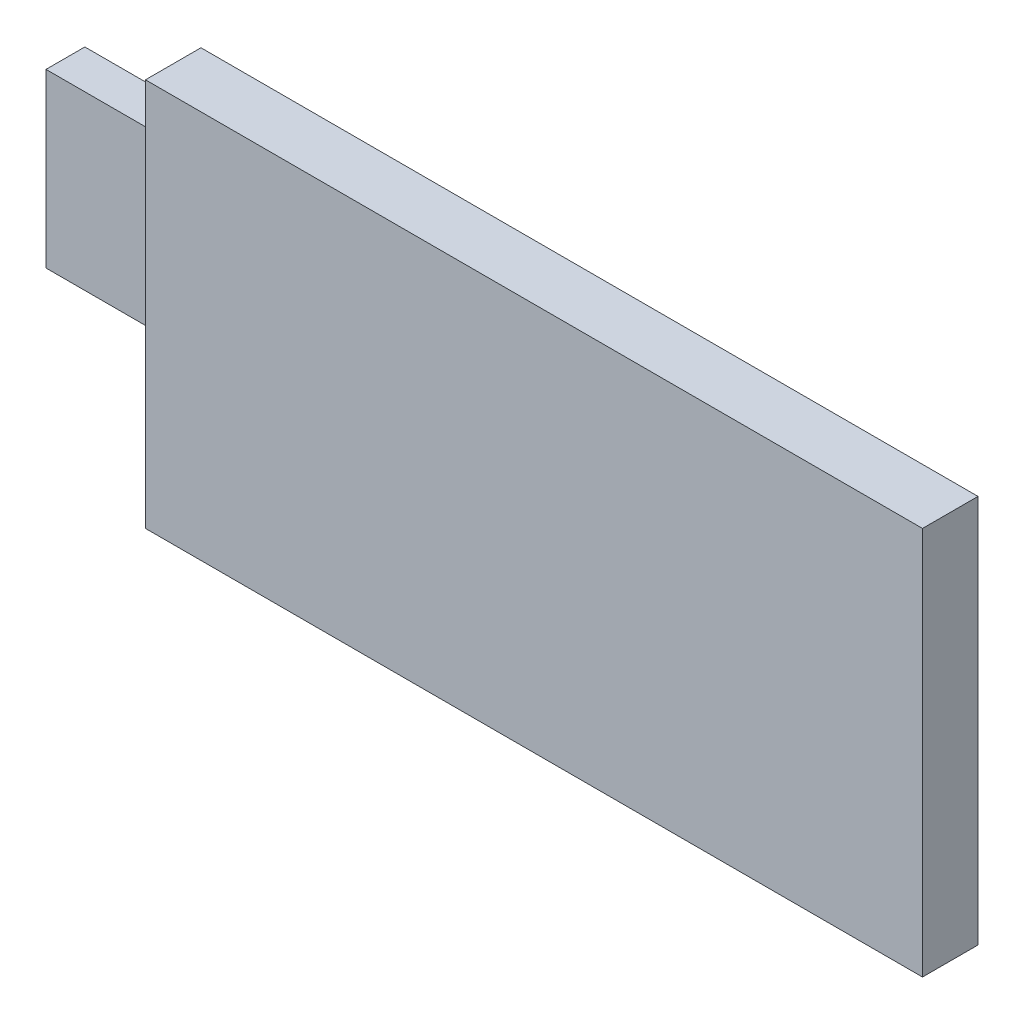
ISO-10303-21;
HEADER;
FILE_DESCRIPTION(('STEP AP214'),'2;1');
FILE_NAME('part.step','',(''),(''),'','','');
FILE_SCHEMA(('AUTOMOTIVE_DESIGN { 1 0 10303 214 1 1 1 1 }'));
ENDSEC;
DATA;
#1=APPLICATION_CONTEXT('core data for automotive mechanical design processes');
#2=APPLICATION_PROTOCOL_DEFINITION('international standard','automotive_design',2000,#1);
#3=PRODUCT_CONTEXT('',#1,'mechanical');
#4=PRODUCT('Part','Part','',(#3));
#5=PRODUCT_RELATED_PRODUCT_CATEGORY('part','',(#4));
#6=PRODUCT_DEFINITION_FORMATION('','',#4);
#7=PRODUCT_DEFINITION_CONTEXT('part definition',#1,'design');
#8=PRODUCT_DEFINITION('design','',#6,#7);
#9=PRODUCT_DEFINITION_SHAPE('','',#8);
#10=(LENGTH_UNIT() NAMED_UNIT(*) SI_UNIT(.MILLI.,.METRE.));
#11=(NAMED_UNIT(*) PLANE_ANGLE_UNIT() SI_UNIT($,.RADIAN.));
#12=(NAMED_UNIT(*) SI_UNIT($,.STERADIAN.) SOLID_ANGLE_UNIT());
#13=UNCERTAINTY_MEASURE_WITH_UNIT(LENGTH_MEASURE(1.E-05),#10,'distance_accuracy_value','');
#14=(GEOMETRIC_REPRESENTATION_CONTEXT(3) GLOBAL_UNCERTAINTY_ASSIGNED_CONTEXT((#13)) GLOBAL_UNIT_ASSIGNED_CONTEXT((#10,
#11,#12)) REPRESENTATION_CONTEXT('',''));
#15=CARTESIAN_POINT('',(0.,0.,0.));
#16=DIRECTION('',(0.,0.,1.));
#17=DIRECTION('',(1.,0.,0.));
#18=AXIS2_PLACEMENT_3D('',#15,#16,#17);
#19=CARTESIAN_POINT('',(-17.78,-8.89,2.54));
#20=DIRECTION('',(1.,0.,0.));
#21=DIRECTION('',(0.,0.,-1.));
#22=AXIS2_PLACEMENT_3D('',#19,#20,#21);
#23=PLANE('',#22);
#24=DIRECTION('',(0.,0.,-1.));
#25=VECTOR('',#24,1.);
#26=CARTESIAN_POINT('',(-17.78,6.26560208146998,2.54));
#27=LINE('',#26,#25);
#28=CARTESIAN_POINT('',(-17.78,6.26560208146998,1.778));
#29=VERTEX_POINT('',#28);
#30=CARTESIAN_POINT('',(-17.78,6.26560208146998,0.));
#31=VERTEX_POINT('',#30);
#32=EDGE_CURVE('E58',#29,#31,#27,.T.);
#33=ORIENTED_EDGE('',*,*,#32,.F.);
#34=DIRECTION('',(0.,-1.,0.));
#35=VECTOR('',#34,1.);
#36=CARTESIAN_POINT('',(-17.78,-8.89,1.778));
#37=LINE('',#36,#35);
#38=CARTESIAN_POINT('',(-17.78,-1.60839791853002,1.778));
#39=VERTEX_POINT('',#38);
#40=EDGE_CURVE('E11',#29,#39,#37,.T.);
#41=ORIENTED_EDGE('',*,*,#40,.T.);
#42=DIRECTION('',(0.,0.,1.));
#43=VECTOR('',#42,1.);
#44=CARTESIAN_POINT('',(-17.78,-1.60839791853002,2.54));
#45=LINE('',#44,#43);
#46=CARTESIAN_POINT('',(-17.78,-1.60839791853002,0.));
#47=VERTEX_POINT('',#46);
#48=EDGE_CURVE('E120',#47,#39,#45,.T.);
#49=ORIENTED_EDGE('',*,*,#48,.F.);
#50=DIRECTION('',(0.,-1.,0.));
#51=VECTOR('',#50,1.);
#52=CARTESIAN_POINT('',(-17.78,-8.89,0.));
#53=LINE('',#52,#51);
#54=CARTESIAN_POINT('',(-17.78,-8.89,0.));
#55=VERTEX_POINT('',#54);
#56=EDGE_CURVE('E168',#47,#55,#53,.T.);
#57=ORIENTED_EDGE('',*,*,#56,.T.);
#58=DIRECTION('',(0.,0.,-1.));
#59=VECTOR('',#58,1.);
#60=CARTESIAN_POINT('',(-17.78,-8.89,2.54));
#61=LINE('',#60,#59);
#62=CARTESIAN_POINT('',(-17.78,-8.89,2.54));
#63=VERTEX_POINT('',#62);
#64=EDGE_CURVE('E177',#63,#55,#61,.T.);
#65=ORIENTED_EDGE('',*,*,#64,.F.);
#66=DIRECTION('',(0.,-1.,0.));
#67=VECTOR('',#66,1.);
#68=CARTESIAN_POINT('',(-17.78,-8.89,2.54));
#69=LINE('',#68,#67);
#70=CARTESIAN_POINT('',(-17.78,8.89,2.54));
#71=VERTEX_POINT('',#70);
#72=EDGE_CURVE('E155',#71,#63,#69,.T.);
#73=ORIENTED_EDGE('',*,*,#72,.F.);
#74=DIRECTION('',(0.,0.,-1.));
#75=VECTOR('',#74,1.);
#76=CARTESIAN_POINT('',(-17.78,8.89,2.54));
#77=LINE('',#76,#75);
#78=CARTESIAN_POINT('',(-17.78,8.89,0.));
#79=VERTEX_POINT('',#78);
#80=EDGE_CURVE('E181',#71,#79,#77,.T.);
#81=ORIENTED_EDGE('',*,*,#80,.T.);
#82=EDGE_CURVE('E169',#79,#31,#53,.T.);
#83=ORIENTED_EDGE('',*,*,#82,.T.);
#84=EDGE_LOOP('',(#33,#41,#49,#57,#65,#73,#81,#83));
#85=FACE_BOUND('',#84,.T.);
#86=ADVANCED_FACE('F39',(#85),#23,.F.);
#87=CARTESIAN_POINT('',(17.78,-8.89,2.54));
#88=DIRECTION('',(-1.,0.,0.));
#89=DIRECTION('',(0.,0.,1.));
#90=AXIS2_PLACEMENT_3D('',#87,#88,#89);
#91=PLANE('',#90);
#92=DIRECTION('',(0.,1.,0.));
#93=VECTOR('',#92,1.);
#94=CARTESIAN_POINT('',(17.78,-8.89,0.));
#95=LINE('',#94,#93);
#96=CARTESIAN_POINT('',(17.78,-8.89,0.));
#97=VERTEX_POINT('',#96);
#98=CARTESIAN_POINT('',(17.78,8.89,0.));
#99=VERTEX_POINT('',#98);
#100=EDGE_CURVE('E146',#97,#99,#95,.T.);
#101=ORIENTED_EDGE('',*,*,#100,.T.);
#102=DIRECTION('',(0.,0.,-1.));
#103=VECTOR('',#102,1.);
#104=CARTESIAN_POINT('',(17.78,8.89,2.54));
#105=LINE('',#104,#103);
#106=CARTESIAN_POINT('',(17.78,8.89,2.54));
#107=VERTEX_POINT('',#106);
#108=EDGE_CURVE('E48',#107,#99,#105,.T.);
#109=ORIENTED_EDGE('',*,*,#108,.F.);
#110=DIRECTION('',(0.,1.,0.));
#111=VECTOR('',#110,1.);
#112=CARTESIAN_POINT('',(17.78,-8.89,2.54));
#113=LINE('',#112,#111);
#114=CARTESIAN_POINT('',(17.78,-8.89,2.54));
#115=VERTEX_POINT('',#114);
#116=EDGE_CURVE('E147',#115,#107,#113,.T.);
#117=ORIENTED_EDGE('',*,*,#116,.F.);
#118=DIRECTION('',(0.,0.,-1.));
#119=VECTOR('',#118,1.);
#120=CARTESIAN_POINT('',(17.78,-8.89,2.54));
#121=LINE('',#120,#119);
#122=EDGE_CURVE('E161',#115,#97,#121,.T.);
#123=ORIENTED_EDGE('',*,*,#122,.T.);
#124=EDGE_LOOP('',(#101,#109,#117,#123));
#125=FACE_BOUND('',#124,.T.);
#126=ADVANCED_FACE('F41',(#125),#91,.F.);
#127=CARTESIAN_POINT('',(-17.78,8.89,2.54));
#128=DIRECTION('',(0.,-1.,0.));
#129=DIRECTION('',(0.,0.,-1.));
#130=AXIS2_PLACEMENT_3D('',#127,#128,#129);
#131=PLANE('',#130);
#132=DIRECTION('',(-1.,0.,0.));
#133=VECTOR('',#132,1.);
#134=CARTESIAN_POINT('',(-17.78,8.89,0.));
#135=LINE('',#134,#133);
#136=EDGE_CURVE('E165',#99,#79,#135,.T.);
#137=ORIENTED_EDGE('',*,*,#136,.T.);
#138=ORIENTED_EDGE('',*,*,#80,.F.);
#139=DIRECTION('',(-1.,0.,0.));
#140=VECTOR('',#139,1.);
#141=CARTESIAN_POINT('',(-17.78,8.89,2.54));
#142=LINE('',#141,#140);
#143=EDGE_CURVE('E151',#107,#71,#142,.T.);
#144=ORIENTED_EDGE('',*,*,#143,.F.);
#145=ORIENTED_EDGE('',*,*,#108,.T.);
#146=EDGE_LOOP('',(#137,#138,#144,#145));
#147=FACE_BOUND('',#146,.T.);
#148=ADVANCED_FACE('F188',(#147),#131,.F.);
#149=CARTESIAN_POINT('',(-17.78,-8.89,2.54));
#150=DIRECTION('',(0.,1.,0.));
#151=DIRECTION('',(0.,0.,1.));
#152=AXIS2_PLACEMENT_3D('',#149,#150,#151);
#153=PLANE('',#152);
#154=DIRECTION('',(1.,0.,0.));
#155=VECTOR('',#154,1.);
#156=CARTESIAN_POINT('',(-17.78,-8.89,0.));
#157=LINE('',#156,#155);
#158=EDGE_CURVE('E152',#55,#97,#157,.T.);
#159=ORIENTED_EDGE('',*,*,#158,.T.);
#160=ORIENTED_EDGE('',*,*,#122,.F.);
#161=DIRECTION('',(1.,0.,0.));
#162=VECTOR('',#161,1.);
#163=CARTESIAN_POINT('',(-17.78,-8.89,2.54));
#164=LINE('',#163,#162);
#165=EDGE_CURVE('E158',#63,#115,#164,.T.);
#166=ORIENTED_EDGE('',*,*,#165,.F.);
#167=ORIENTED_EDGE('',*,*,#64,.T.);
#168=EDGE_LOOP('',(#159,#160,#166,#167));
#169=FACE_BOUND('',#168,.T.);
#170=ADVANCED_FACE('F204',(#169),#153,.F.);
#171=CARTESIAN_POINT('',(0.,0.,2.54));
#172=DIRECTION('',(0.,0.,-1.));
#173=DIRECTION('',(-1.,0.,0.));
#174=AXIS2_PLACEMENT_3D('',#171,#172,#173);
#175=PLANE('',#174);
#176=ORIENTED_EDGE('',*,*,#116,.T.);
#177=ORIENTED_EDGE('',*,*,#143,.T.);
#178=ORIENTED_EDGE('',*,*,#72,.T.);
#179=ORIENTED_EDGE('',*,*,#165,.T.);
#180=EDGE_LOOP('',(#176,#177,#178,#179));
#181=FACE_BOUND('',#180,.T.);
#182=ADVANCED_FACE('F202',(#181),#175,.F.);
#183=CARTESIAN_POINT('',(0.,0.,0.));
#184=DIRECTION('',(0.,0.,-1.));
#185=DIRECTION('',(-1.,0.,0.));
#186=AXIS2_PLACEMENT_3D('',#183,#184,#185);
#187=PLANE('',#186);
#188=ORIENTED_EDGE('',*,*,#56,.F.);
#189=DIRECTION('',(1.,0.,0.));
#190=VECTOR('',#189,1.);
#191=CARTESIAN_POINT('',(-23.09315588451,-1.60839791853002,0.));
#192=LINE('',#191,#190);
#193=CARTESIAN_POINT('',(-23.09315588451,-1.60839791853002,0.));
#194=VERTEX_POINT('',#193);
#195=EDGE_CURVE('E110',#194,#47,#192,.T.);
#196=ORIENTED_EDGE('',*,*,#195,.F.);
#197=DIRECTION('',(0.,-1.,0.));
#198=VECTOR('',#197,1.);
#199=CARTESIAN_POINT('',(-23.09315588451,6.26560208146998,0.));
#200=LINE('',#199,#198);
#201=CARTESIAN_POINT('',(-23.09315588451,6.26560208146998,0.));
#202=VERTEX_POINT('',#201);
#203=EDGE_CURVE('E134',#202,#194,#200,.T.);
#204=ORIENTED_EDGE('',*,*,#203,.F.);
#205=DIRECTION('',(-1.,0.,0.));
#206=VECTOR('',#205,1.);
#207=CARTESIAN_POINT('',(-23.09315588451,6.26560208146998,0.));
#208=LINE('',#207,#206);
#209=EDGE_CURVE('E116',#31,#202,#208,.T.);
#210=ORIENTED_EDGE('',*,*,#209,.F.);
#211=ORIENTED_EDGE('',*,*,#82,.F.);
#212=ORIENTED_EDGE('',*,*,#136,.F.);
#213=ORIENTED_EDGE('',*,*,#100,.F.);
#214=ORIENTED_EDGE('',*,*,#158,.F.);
#215=EDGE_LOOP('',(#188,#196,#204,#210,#211,#212,#213,#214));
#216=FACE_BOUND('',#215,.T.);
#217=ADVANCED_FACE('F196',(#216),#187,.T.);
#218=CARTESIAN_POINT('',(0.,0.,1.778));
#219=DIRECTION('',(0.,0.,1.));
#220=DIRECTION('',(1.,0.,0.));
#221=AXIS2_PLACEMENT_3D('',#218,#219,#220);
#222=PLANE('',#221);
#223=ORIENTED_EDGE('',*,*,#40,.F.);
#224=DIRECTION('',(-1.,0.,0.));
#225=VECTOR('',#224,1.);
#226=CARTESIAN_POINT('',(-23.09315588451,6.26560208146998,1.778));
#227=LINE('',#226,#225);
#228=CARTESIAN_POINT('',(-23.09315588451,6.26560208146998,1.778));
#229=VERTEX_POINT('',#228);
#230=EDGE_CURVE('E101',#29,#229,#227,.T.);
#231=ORIENTED_EDGE('',*,*,#230,.T.);
#232=DIRECTION('',(0.,-1.,0.));
#233=VECTOR('',#232,1.);
#234=CARTESIAN_POINT('',(-23.09315588451,6.26560208146998,1.778));
#235=LINE('',#234,#233);
#236=CARTESIAN_POINT('',(-23.09315588451,-1.60839791853002,1.778));
#237=VERTEX_POINT('',#236);
#238=EDGE_CURVE('E106',#229,#237,#235,.T.);
#239=ORIENTED_EDGE('',*,*,#238,.T.);
#240=DIRECTION('',(1.,0.,0.));
#241=VECTOR('',#240,1.);
#242=CARTESIAN_POINT('',(-23.09315588451,-1.60839791853002,1.778));
#243=LINE('',#242,#241);
#244=EDGE_CURVE('E127',#237,#39,#243,.T.);
#245=ORIENTED_EDGE('',*,*,#244,.T.);
#246=EDGE_LOOP('',(#223,#231,#239,#245));
#247=FACE_BOUND('',#246,.T.);
#248=ADVANCED_FACE('F103',(#247),#222,.T.);
#249=CARTESIAN_POINT('',(-23.09315588451,6.26560208146998,1.778));
#250=DIRECTION('',(0.,-1.,0.));
#251=DIRECTION('',(0.,0.,-1.));
#252=AXIS2_PLACEMENT_3D('',#249,#250,#251);
#253=PLANE('',#252);
#254=ORIENTED_EDGE('',*,*,#230,.F.);
#255=ORIENTED_EDGE('',*,*,#32,.T.);
#256=ORIENTED_EDGE('',*,*,#209,.T.);
#257=DIRECTION('',(0.,0.,-1.));
#258=VECTOR('',#257,1.);
#259=CARTESIAN_POINT('',(-23.09315588451,6.26560208146998,1.778));
#260=LINE('',#259,#258);
#261=EDGE_CURVE('E113',#229,#202,#260,.T.);
#262=ORIENTED_EDGE('',*,*,#261,.F.);
#263=EDGE_LOOP('',(#254,#255,#256,#262));
#264=FACE_BOUND('',#263,.T.);
#265=ADVANCED_FACE('F114',(#264),#253,.F.);
#266=CARTESIAN_POINT('',(-23.09315588451,-1.60839791853002,1.778));
#267=DIRECTION('',(0.,1.,0.));
#268=DIRECTION('',(0.,0.,1.));
#269=AXIS2_PLACEMENT_3D('',#266,#267,#268);
#270=PLANE('',#269);
#271=ORIENTED_EDGE('',*,*,#195,.T.);
#272=ORIENTED_EDGE('',*,*,#48,.T.);
#273=ORIENTED_EDGE('',*,*,#244,.F.);
#274=DIRECTION('',(0.,0.,-1.));
#275=VECTOR('',#274,1.);
#276=CARTESIAN_POINT('',(-23.09315588451,-1.60839791853002,1.778));
#277=LINE('',#276,#275);
#278=EDGE_CURVE('E121',#237,#194,#277,.T.);
#279=ORIENTED_EDGE('',*,*,#278,.T.);
#280=EDGE_LOOP('',(#271,#272,#273,#279));
#281=FACE_BOUND('',#280,.T.);
#282=ADVANCED_FACE('F263',(#281),#270,.F.);
#283=CARTESIAN_POINT('',(-23.09315588451,6.26560208146998,1.778));
#284=DIRECTION('',(1.,0.,0.));
#285=DIRECTION('',(0.,0.,-1.));
#286=AXIS2_PLACEMENT_3D('',#283,#284,#285);
#287=PLANE('',#286);
#288=ORIENTED_EDGE('',*,*,#203,.T.);
#289=ORIENTED_EDGE('',*,*,#278,.F.);
#290=ORIENTED_EDGE('',*,*,#238,.F.);
#291=ORIENTED_EDGE('',*,*,#261,.T.);
#292=EDGE_LOOP('',(#288,#289,#290,#291));
#293=FACE_BOUND('',#292,.T.);
#294=ADVANCED_FACE('F123',(#293),#287,.F.);
#295=CLOSED_SHELL('',(#86,#126,#148,#170,#182,#217,#248,#265,#282,#294));
#296=MANIFOLD_SOLID_BREP('B2',#295);
#297=ADVANCED_BREP_SHAPE_REPRESENTATION('',(#18,#296),#14);
#298=SHAPE_DEFINITION_REPRESENTATION(#9,#297);
ENDSEC;
END-ISO-10303-21;
